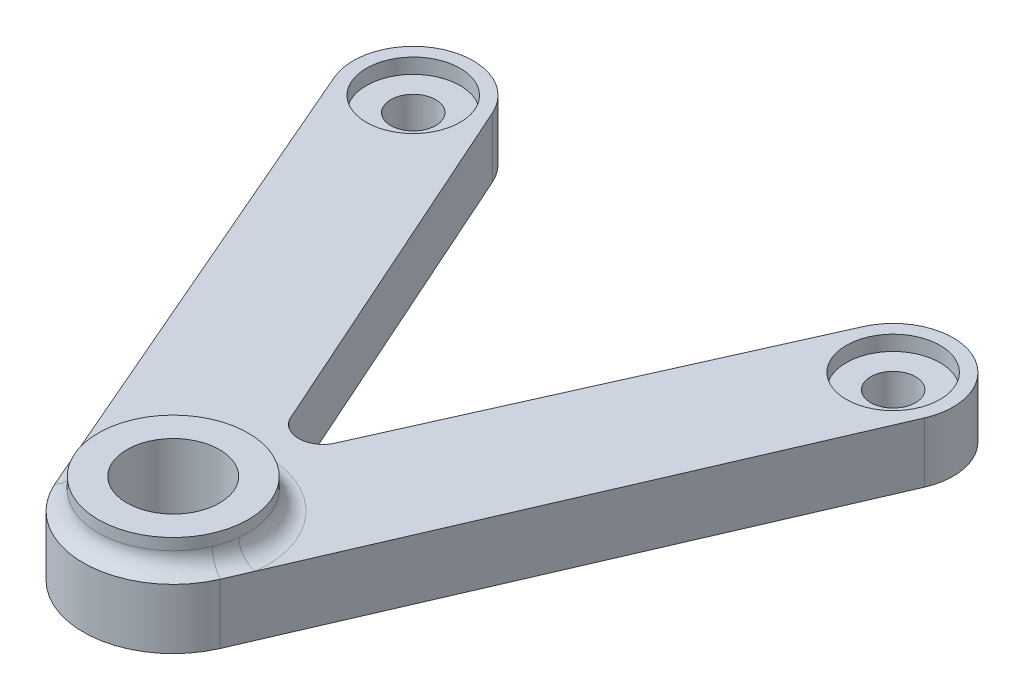
ISO-10303-21;
HEADER;
FILE_DESCRIPTION(('STEP AP214'),'2;1');
FILE_NAME('part.step','',(''),(''),'','','');
FILE_SCHEMA(('AUTOMOTIVE_DESIGN { 1 0 10303 214 1 1 1 1 }'));
ENDSEC;
DATA;
#1=APPLICATION_CONTEXT('core data for automotive mechanical design processes');
#2=APPLICATION_PROTOCOL_DEFINITION('international standard','automotive_design',2000,#1);
#3=PRODUCT_CONTEXT('',#1,'mechanical');
#4=PRODUCT('Part','Part','',(#3));
#5=PRODUCT_RELATED_PRODUCT_CATEGORY('part','',(#4));
#6=PRODUCT_DEFINITION_FORMATION('','',#4);
#7=PRODUCT_DEFINITION_CONTEXT('part definition',#1,'design');
#8=PRODUCT_DEFINITION('design','',#6,#7);
#9=PRODUCT_DEFINITION_SHAPE('','',#8);
#10=(LENGTH_UNIT() NAMED_UNIT(*) SI_UNIT(.MILLI.,.METRE.));
#11=(NAMED_UNIT(*) PLANE_ANGLE_UNIT() SI_UNIT($,.RADIAN.));
#12=(NAMED_UNIT(*) SI_UNIT($,.STERADIAN.) SOLID_ANGLE_UNIT());
#13=UNCERTAINTY_MEASURE_WITH_UNIT(LENGTH_MEASURE(1.E-05),#10,'distance_accuracy_value','');
#14=(GEOMETRIC_REPRESENTATION_CONTEXT(3) GLOBAL_UNCERTAINTY_ASSIGNED_CONTEXT((#13)) GLOBAL_UNIT_ASSIGNED_CONTEXT((#10,
#11,#12)) REPRESENTATION_CONTEXT('',''));
#15=CARTESIAN_POINT('',(0.,0.,0.));
#16=DIRECTION('',(0.,0.,1.));
#17=DIRECTION('',(1.,0.,0.));
#18=AXIS2_PLACEMENT_3D('',#15,#16,#17);
#19=CARTESIAN_POINT('',(0.,6.35,-19.1326419315339));
#20=DIRECTION('',(0.,-1.,0.));
#21=DIRECTION('',(0.,0.,-1.));
#22=AXIS2_PLACEMENT_3D('',#19,#20,#21);
#23=CYLINDRICAL_SURFACE('',#22,2.60351351052223);
#24=CARTESIAN_POINT('',(0.,0.,-19.1326419315339));
#25=DIRECTION('',(0.,1.,0.));
#26=DIRECTION('',(0.,0.,1.));
#27=AXIS2_PLACEMENT_3D('',#24,#25,#26);
#28=CIRCLE('',#27,2.60351351052223);
#29=CARTESIAN_POINT('',(-2.26024053048188,0.,-17.8405137088568));
#30=VERTEX_POINT('',#29);
#31=CARTESIAN_POINT('',(2.26024053048188,0.,-17.8405137088568));
#32=VERTEX_POINT('',#31);
#33=EDGE_CURVE('E129',#30,#32,#28,.T.);
#34=ORIENTED_EDGE('',*,*,#33,.F.);
#35=DIRECTION('',(0.,-1.,0.));
#36=VECTOR('',#35,1.);
#37=CARTESIAN_POINT('',(-2.26024053048188,6.35,-17.8405137088568));
#38=LINE('',#37,#36);
#39=CARTESIAN_POINT('',(-2.26024053048188,6.35,-17.8405137088568));
#40=VERTEX_POINT('',#39);
#41=EDGE_CURVE('E123',#40,#30,#38,.T.);
#42=ORIENTED_EDGE('',*,*,#41,.F.);
#43=CARTESIAN_POINT('',(0.,6.35,-19.1326419315339));
#44=DIRECTION('',(0.,1.,0.));
#45=DIRECTION('',(0.,0.,1.));
#46=AXIS2_PLACEMENT_3D('',#43,#44,#45);
#47=CIRCLE('',#46,2.60351351052223);
#48=CARTESIAN_POINT('',(2.26024053048188,6.35,-17.8405137088568));
#49=VERTEX_POINT('',#48);
#50=EDGE_CURVE('E126',#40,#49,#47,.T.);
#51=ORIENTED_EDGE('',*,*,#50,.T.);
#52=DIRECTION('',(0.,-1.,0.));
#53=VECTOR('',#52,1.);
#54=CARTESIAN_POINT('',(2.26024053048188,6.35,-17.8405137088568));
#55=LINE('',#54,#53);
#56=EDGE_CURVE('E171',#49,#32,#55,.T.);
#57=ORIENTED_EDGE('',*,*,#56,.T.);
#58=EDGE_LOOP('',(#34,#42,#51,#57));
#59=FACE_BOUND('',#58,.T.);
#60=ADVANCED_FACE('F37',(#59),#23,.F.);
#61=CARTESIAN_POINT('',(4.7614095283321,6.35,-2.12775872381943));
#62=DIRECTION('',(-0.912985825560001,0.,0.407991277267693));
#63=DIRECTION('',(0.407991277267693,0.,0.912985825560001));
#64=AXIS2_PLACEMENT_3D('',#61,#62,#63);
#65=PLANE('',#64);
#66=DIRECTION('',(-0.407991277267693,0.,-0.912985825560001));
#67=VECTOR('',#66,1.);
#68=CARTESIAN_POINT('',(4.7614095283321,0.,-2.12775872381943));
#69=LINE('',#68,#67);
#70=CARTESIAN_POINT('',(-19.602540007694,0.,-56.6483865421838));
#71=VERTEX_POINT('',#70);
#72=EDGE_CURVE('E173',#30,#71,#69,.T.);
#73=ORIENTED_EDGE('',*,*,#72,.T.);
#74=DIRECTION('',(0.,-1.,0.));
#75=VECTOR('',#74,1.);
#76=CARTESIAN_POINT('',(-19.602540007694,6.35,-56.6483865421838));
#77=LINE('',#76,#75);
#78=CARTESIAN_POINT('',(-19.602540007694,6.35,-56.6483865421838));
#79=VERTEX_POINT('',#78);
#80=EDGE_CURVE('E134',#79,#71,#77,.T.);
#81=ORIENTED_EDGE('',*,*,#80,.F.);
#82=DIRECTION('',(-0.407991277267693,0.,-0.912985825560001));
#83=VECTOR('',#82,1.);
#84=CARTESIAN_POINT('',(4.7614095283321,6.35,-2.12775872381943));
#85=LINE('',#84,#83);
#86=EDGE_CURVE('E138',#40,#79,#85,.T.);
#87=ORIENTED_EDGE('',*,*,#86,.F.);
#88=ORIENTED_EDGE('',*,*,#41,.T.);
#89=EDGE_LOOP('',(#73,#81,#87,#88));
#90=FACE_BOUND('',#89,.T.);
#91=ADVANCED_FACE('F139',(#90),#65,.F.);
#92=CARTESIAN_POINT('',(-25.4,6.35,-54.0576419315339));
#93=DIRECTION('',(0.,-1.,0.));
#94=DIRECTION('',(0.,0.,-1.));
#95=AXIS2_PLACEMENT_3D('',#92,#93,#94);
#96=CYLINDRICAL_SURFACE('',#95,6.35);
#97=CARTESIAN_POINT('',(-25.4,0.,-54.0576419315339));
#98=DIRECTION('',(0.,1.,0.));
#99=DIRECTION('',(0.,0.,1.));
#100=AXIS2_PLACEMENT_3D('',#97,#98,#99);
#101=CIRCLE('',#100,6.35);
#102=CARTESIAN_POINT('',(-31.2294813240886,0.,-51.5397762694896));
#103=VERTEX_POINT('',#102);
#104=EDGE_CURVE('E175',#71,#103,#101,.T.);
#105=ORIENTED_EDGE('',*,*,#104,.T.);
#106=DIRECTION('',(0.,-1.,0.));
#107=VECTOR('',#106,1.);
#108=CARTESIAN_POINT('',(-31.2294813240886,6.35,-51.5397762694896));
#109=LINE('',#108,#107);
#110=CARTESIAN_POINT('',(-31.2294813240886,6.35,-51.5397762694896));
#111=VERTEX_POINT('',#110);
#112=EDGE_CURVE('E199',#111,#103,#109,.T.);
#113=ORIENTED_EDGE('',*,*,#112,.F.);
#114=CARTESIAN_POINT('',(-25.4,6.35,-54.0576419315339));
#115=DIRECTION('',(0.,1.,0.));
#116=DIRECTION('',(0.,0.,1.));
#117=AXIS2_PLACEMENT_3D('',#114,#115,#116);
#118=CIRCLE('',#117,6.35);
#119=EDGE_CURVE('E142',#79,#111,#118,.T.);
#120=ORIENTED_EDGE('',*,*,#119,.F.);
#121=ORIENTED_EDGE('',*,*,#80,.T.);
#122=EDGE_LOOP('',(#105,#113,#120,#121));
#123=FACE_BOUND('',#122,.T.);
#124=ADVANCED_FACE('F295',(#123),#96,.T.);
#125=CARTESIAN_POINT('',(-7.55840309085105,6.35,3.26462039147518));
#126=DIRECTION('',(0.918028554974588,0.,-0.396514277487294));
#127=DIRECTION('',(-0.396514277487294,0.,-0.918028554974588));
#128=AXIS2_PLACEMENT_3D('',#125,#126,#127);
#129=PLANE('',#128);
#130=DIRECTION('',(0.396514277487294,0.,0.918028554974588));
#131=VECTOR('',#130,1.);
#132=CARTESIAN_POINT('',(-7.55840309085105,0.,3.26462039147518));
#133=LINE('',#132,#131);
#134=CARTESIAN_POINT('',(-8.74422198613295,0.,0.519156561532535));
#135=VERTEX_POINT('',#134);
#136=EDGE_CURVE('E178',#103,#135,#133,.T.);
#137=ORIENTED_EDGE('',*,*,#136,.T.);
#138=DIRECTION('',(0.,-1.,0.));
#139=VECTOR('',#138,1.);
#140=CARTESIAN_POINT('',(-8.74422198613295,6.35,0.519156561532535));
#141=LINE('',#140,#139);
#142=CARTESIAN_POINT('',(-8.74422198613295,6.35,0.519156561532535));
#143=VERTEX_POINT('',#142);
#144=EDGE_CURVE('E196',#143,#135,#141,.T.);
#145=ORIENTED_EDGE('',*,*,#144,.F.);
#146=DIRECTION('',(0.396514277487294,0.,0.918028554974588));
#147=VECTOR('',#146,1.);
#148=CARTESIAN_POINT('',(-7.55840309085105,6.35,3.26462039147518));
#149=LINE('',#148,#147);
#150=CARTESIAN_POINT('',(-9.867714334644,6.35,-2.08200590798701));
#151=VERTEX_POINT('',#150);
#152=EDGE_CURVE('E158',#151,#143,#149,.T.);
#153=ORIENTED_EDGE('',*,*,#152,.F.);
#154=EDGE_CURVE('E159',#111,#151,#149,.T.);
#155=ORIENTED_EDGE('',*,*,#154,.F.);
#156=ORIENTED_EDGE('',*,*,#112,.T.);
#157=EDGE_LOOP('',(#137,#145,#153,#155,#156));
#158=FACE_BOUND('',#157,.T.);
#159=ADVANCED_FACE('F299',(#158),#129,.F.);
#160=CARTESIAN_POINT('',(0.,6.35,-3.25764193153394));
#161=DIRECTION('',(0.,-1.,0.));
#162=DIRECTION('',(0.,0.,-1.));
#163=AXIS2_PLACEMENT_3D('',#160,#161,#162);
#164=CYLINDRICAL_SURFACE('',#163,9.52500000000001);
#165=CARTESIAN_POINT('',(0.,0.,-3.25764193153394));
#166=DIRECTION('',(0.,1.,0.));
#167=DIRECTION('',(0.,0.,1.));
#168=AXIS2_PLACEMENT_3D('',#165,#166,#167);
#169=CIRCLE('',#168,9.52500000000001);
#170=CARTESIAN_POINT('',(8.74422198613295,0.,0.519156561532535));
#171=VERTEX_POINT('',#170);
#172=EDGE_CURVE('E181',#135,#171,#169,.T.);
#173=ORIENTED_EDGE('',*,*,#172,.T.);
#174=DIRECTION('',(0.,-1.,0.));
#175=VECTOR('',#174,1.);
#176=CARTESIAN_POINT('',(8.74422198613295,6.35,0.519156561532535));
#177=LINE('',#176,#175);
#178=CARTESIAN_POINT('',(8.74422198613295,6.35,0.519156561532535));
#179=VERTEX_POINT('',#178);
#180=EDGE_CURVE('E194',#179,#171,#177,.T.);
#181=ORIENTED_EDGE('',*,*,#180,.F.);
#182=CARTESIAN_POINT('',(0.,6.35,-3.25764193153394));
#183=DIRECTION('',(0.,1.,0.));
#184=DIRECTION('',(0.,0.,1.));
#185=AXIS2_PLACEMENT_3D('',#182,#183,#184);
#186=CIRCLE('',#185,9.52500000000001);
#187=EDGE_CURVE('E161',#143,#179,#186,.T.);
#188=ORIENTED_EDGE('',*,*,#187,.F.);
#189=ORIENTED_EDGE('',*,*,#144,.T.);
#190=EDGE_LOOP('',(#173,#181,#188,#189));
#191=FACE_BOUND('',#190,.T.);
#192=ADVANCED_FACE('F306',(#191),#164,.T.);
#193=CARTESIAN_POINT('',(7.55840309085105,6.35,3.26462039147518));
#194=DIRECTION('',(0.918028554974588,0.,0.396514277487294));
#195=DIRECTION('',(0.396514277487294,0.,-0.918028554974588));
#196=AXIS2_PLACEMENT_3D('',#193,#194,#195);
#197=PLANE('',#196);
#198=DIRECTION('',(-0.396514277487294,0.,0.918028554974588));
#199=VECTOR('',#198,1.);
#200=CARTESIAN_POINT('',(7.55840309085105,0.,3.26462039147518));
#201=LINE('',#200,#199);
#202=CARTESIAN_POINT('',(31.2294813240886,0.,-51.5397762694896));
#203=VERTEX_POINT('',#202);
#204=EDGE_CURVE('E184',#203,#171,#201,.T.);
#205=ORIENTED_EDGE('',*,*,#204,.F.);
#206=DIRECTION('',(0.,-1.,0.));
#207=VECTOR('',#206,1.);
#208=CARTESIAN_POINT('',(31.2294813240886,6.35,-51.5397762694896));
#209=LINE('',#208,#207);
#210=CARTESIAN_POINT('',(31.2294813240886,6.35,-51.5397762694896));
#211=VERTEX_POINT('',#210);
#212=EDGE_CURVE('E192',#211,#203,#209,.T.);
#213=ORIENTED_EDGE('',*,*,#212,.F.);
#214=DIRECTION('',(-0.396514277487294,0.,0.918028554974588));
#215=VECTOR('',#214,1.);
#216=CARTESIAN_POINT('',(7.55840309085105,6.35,3.26462039147518));
#217=LINE('',#216,#215);
#218=CARTESIAN_POINT('',(9.867714334644,6.35,-2.08200590798701));
#219=VERTEX_POINT('',#218);
#220=EDGE_CURVE('E165',#211,#219,#217,.T.);
#221=ORIENTED_EDGE('',*,*,#220,.T.);
#222=EDGE_CURVE('E164',#219,#179,#217,.T.);
#223=ORIENTED_EDGE('',*,*,#222,.T.);
#224=ORIENTED_EDGE('',*,*,#180,.T.);
#225=EDGE_LOOP('',(#205,#213,#221,#223,#224));
#226=FACE_BOUND('',#225,.T.);
#227=ADVANCED_FACE('F350',(#226),#197,.T.);
#228=CARTESIAN_POINT('',(25.4,6.35,-54.0576419315339));
#229=DIRECTION('',(0.,-1.,0.));
#230=DIRECTION('',(0.,0.,-1.));
#231=AXIS2_PLACEMENT_3D('',#228,#229,#230);
#232=CYLINDRICAL_SURFACE('',#231,6.35);
#233=CARTESIAN_POINT('',(25.4,0.,-54.0576419315339));
#234=DIRECTION('',(0.,1.,0.));
#235=DIRECTION('',(0.,0.,1.));
#236=AXIS2_PLACEMENT_3D('',#233,#234,#235);
#237=CIRCLE('',#236,6.35);
#238=CARTESIAN_POINT('',(19.602540007694,0.,-56.6483865421838));
#239=VERTEX_POINT('',#238);
#240=EDGE_CURVE('E151',#239,#203,#237,.F.);
#241=ORIENTED_EDGE('',*,*,#240,.F.);
#242=DIRECTION('',(0.,-1.,0.));
#243=VECTOR('',#242,1.);
#244=CARTESIAN_POINT('',(19.602540007694,6.35,-56.6483865421838));
#245=LINE('',#244,#243);
#246=CARTESIAN_POINT('',(19.602540007694,6.35,-56.6483865421838));
#247=VERTEX_POINT('',#246);
#248=EDGE_CURVE('E190',#247,#239,#245,.T.);
#249=ORIENTED_EDGE('',*,*,#248,.F.);
#250=CARTESIAN_POINT('',(25.4,6.35,-54.0576419315339));
#251=DIRECTION('',(0.,1.,0.));
#252=DIRECTION('',(0.,0.,1.));
#253=AXIS2_PLACEMENT_3D('',#250,#251,#252);
#254=CIRCLE('',#253,6.35);
#255=EDGE_CURVE('E167',#247,#211,#254,.F.);
#256=ORIENTED_EDGE('',*,*,#255,.T.);
#257=ORIENTED_EDGE('',*,*,#212,.T.);
#258=EDGE_LOOP('',(#241,#249,#256,#257));
#259=FACE_BOUND('',#258,.T.);
#260=ADVANCED_FACE('F355',(#259),#232,.T.);
#261=CARTESIAN_POINT('',(-4.7614095283321,6.35,-2.12775872381943));
#262=DIRECTION('',(-0.912985825560001,0.,-0.407991277267693));
#263=DIRECTION('',(-0.407991277267693,0.,0.912985825560001));
#264=AXIS2_PLACEMENT_3D('',#261,#262,#263);
#265=PLANE('',#264);
#266=DIRECTION('',(0.407991277267693,0.,-0.912985825560001));
#267=VECTOR('',#266,1.);
#268=CARTESIAN_POINT('',(-4.7614095283321,0.,-2.12775872381943));
#269=LINE('',#268,#267);
#270=EDGE_CURVE('E148',#32,#239,#269,.T.);
#271=ORIENTED_EDGE('',*,*,#270,.F.);
#272=ORIENTED_EDGE('',*,*,#56,.F.);
#273=DIRECTION('',(0.407991277267693,0.,-0.912985825560001));
#274=VECTOR('',#273,1.);
#275=CARTESIAN_POINT('',(-4.7614095283321,6.35,-2.12775872381943));
#276=LINE('',#275,#274);
#277=EDGE_CURVE('E147',#49,#247,#276,.T.);
#278=ORIENTED_EDGE('',*,*,#277,.T.);
#279=ORIENTED_EDGE('',*,*,#248,.T.);
#280=EDGE_LOOP('',(#271,#272,#278,#279));
#281=FACE_BOUND('',#280,.T.);
#282=ADVANCED_FACE('F358',(#281),#265,.T.);
#283=CARTESIAN_POINT('',(0.,6.35,0.));
#284=DIRECTION('',(0.,1.,0.));
#285=DIRECTION('',(0.,0.,1.));
#286=AXIS2_PLACEMENT_3D('',#283,#284,#285);
#287=PLANE('',#286);
#288=CARTESIAN_POINT('',(-25.4,6.35,-54.0576419315339));
#289=DIRECTION('',(0.,1.,0.));
#290=DIRECTION('',(0.,0.,1.));
#291=AXIS2_PLACEMENT_3D('',#288,#289,#290);
#292=CIRCLE('',#291,4.96100099999999);
#293=CARTESIAN_POINT('',(-25.4,6.35,-49.0966409315339));
#294=VERTEX_POINT('',#293);
#295=EDGE_CURVE('E399',#294,#294,#292,.T.);
#296=ORIENTED_EDGE('',*,*,#295,.F.);
#297=EDGE_LOOP('',(#296));
#298=FACE_BOUND('',#297,.T.);
#299=CARTESIAN_POINT('',(25.4,6.35,-54.0576419315339));
#300=DIRECTION('',(0.,1.,0.));
#301=DIRECTION('',(0.,0.,1.));
#302=AXIS2_PLACEMENT_3D('',#299,#300,#301);
#303=CIRCLE('',#302,4.96100099999999);
#304=CARTESIAN_POINT('',(25.4,6.35,-49.096640931534));
#305=VERTEX_POINT('',#304);
#306=EDGE_CURVE('E253',#305,#305,#303,.T.);
#307=ORIENTED_EDGE('',*,*,#306,.F.);
#308=EDGE_LOOP('',(#307));
#309=FACE_BOUND('',#308,.T.);
#310=ORIENTED_EDGE('',*,*,#154,.T.);
#311=CARTESIAN_POINT('',(0.,6.35,-3.25764193153394));
#312=DIRECTION('',(0.,1.,0.));
#313=DIRECTION('',(0.,0.,1.));
#314=AXIS2_PLACEMENT_3D('',#311,#312,#313);
#315=CIRCLE('',#314,9.9375);
#316=EDGE_CURVE('E11',#151,#219,#315,.F.);
#317=ORIENTED_EDGE('',*,*,#316,.T.);
#318=ORIENTED_EDGE('',*,*,#220,.F.);
#319=ORIENTED_EDGE('',*,*,#255,.F.);
#320=ORIENTED_EDGE('',*,*,#277,.F.);
#321=ORIENTED_EDGE('',*,*,#50,.F.);
#322=ORIENTED_EDGE('',*,*,#86,.T.);
#323=ORIENTED_EDGE('',*,*,#119,.T.);
#324=EDGE_LOOP('',(#310,#317,#318,#319,#320,#321,#322,#323));
#325=FACE_BOUND('',#324,.T.);
#326=ADVANCED_FACE('F144',(#298,#309,#325),#287,.T.);
#327=CARTESIAN_POINT('',(0.,0.,0.));
#328=DIRECTION('',(0.,1.,0.));
#329=DIRECTION('',(0.,0.,1.));
#330=AXIS2_PLACEMENT_3D('',#327,#328,#329);
#331=PLANE('',#330);
#332=CARTESIAN_POINT('',(0.,0.,-3.25764193153394));
#333=DIRECTION('',(0.,1.,0.));
#334=DIRECTION('',(0.,0.,1.));
#335=AXIS2_PLACEMENT_3D('',#332,#333,#334);
#336=CIRCLE('',#335,4.90219999999999);
#337=CARTESIAN_POINT('',(0.,0.,1.64455806846605));
#338=VERTEX_POINT('',#337);
#339=EDGE_CURVE('E264',#338,#338,#336,.T.);
#340=ORIENTED_EDGE('',*,*,#339,.T.);
#341=EDGE_LOOP('',(#340));
#342=FACE_BOUND('',#341,.T.);
#343=CARTESIAN_POINT('',(-25.4,0.,-54.0576419315339));
#344=DIRECTION('',(0.,1.,0.));
#345=DIRECTION('',(0.,0.,1.));
#346=AXIS2_PLACEMENT_3D('',#343,#344,#345);
#347=CIRCLE('',#346,2.38125);
#348=CARTESIAN_POINT('',(-25.4,0.,-51.6763919315339));
#349=VERTEX_POINT('',#348);
#350=EDGE_CURVE('E270',#349,#349,#347,.T.);
#351=ORIENTED_EDGE('',*,*,#350,.T.);
#352=EDGE_LOOP('',(#351));
#353=FACE_BOUND('',#352,.T.);
#354=CARTESIAN_POINT('',(25.4,0.,-54.0576419315339));
#355=DIRECTION('',(0.,1.,0.));
#356=DIRECTION('',(0.,0.,1.));
#357=AXIS2_PLACEMENT_3D('',#354,#355,#356);
#358=CIRCLE('',#357,2.38125);
#359=CARTESIAN_POINT('',(25.4,0.,-51.6763919315339));
#360=VERTEX_POINT('',#359);
#361=EDGE_CURVE('E154',#360,#360,#358,.T.);
#362=ORIENTED_EDGE('',*,*,#361,.T.);
#363=EDGE_LOOP('',(#362));
#364=FACE_BOUND('',#363,.T.);
#365=ORIENTED_EDGE('',*,*,#33,.T.);
#366=ORIENTED_EDGE('',*,*,#270,.T.);
#367=ORIENTED_EDGE('',*,*,#240,.T.);
#368=ORIENTED_EDGE('',*,*,#204,.T.);
#369=ORIENTED_EDGE('',*,*,#172,.F.);
#370=ORIENTED_EDGE('',*,*,#136,.F.);
#371=ORIENTED_EDGE('',*,*,#104,.F.);
#372=ORIENTED_EDGE('',*,*,#72,.F.);
#373=EDGE_LOOP('',(#365,#366,#367,#368,#369,#370,#371,#372));
#374=FACE_BOUND('',#373,.T.);
#375=ADVANCED_FACE('F277',(#342,#353,#364,#374),#331,.F.);
#376=CARTESIAN_POINT('',(25.4,6.35,-54.0576419315339));
#377=DIRECTION('',(0.,1.,0.));
#378=DIRECTION('',(0.,0.,1.));
#379=AXIS2_PLACEMENT_3D('',#376,#377,#378);
#380=CYLINDRICAL_SURFACE('',#379,2.38125);
#381=CARTESIAN_POINT('',(25.4,4.7625,-54.0576419315339));
#382=DIRECTION('',(0.,-1.,0.));
#383=DIRECTION('',(0.,0.,-1.));
#384=AXIS2_PLACEMENT_3D('',#381,#382,#383);
#385=CIRCLE('',#384,2.38125);
#386=CARTESIAN_POINT('',(25.4,4.7625,-56.4388919315339));
#387=VERTEX_POINT('',#386);
#388=EDGE_CURVE('E244',#387,#387,#385,.F.);
#389=ORIENTED_EDGE('',*,*,#388,.T.);
#390=EDGE_LOOP('',(#389));
#391=FACE_BOUND('',#390,.T.);
#392=ORIENTED_EDGE('',*,*,#361,.F.);
#393=EDGE_LOOP('',(#392));
#394=FACE_BOUND('',#393,.T.);
#395=ADVANCED_FACE('F280',(#391,#394),#380,.F.);
#396=CARTESIAN_POINT('',(-25.4,6.35,-54.0576419315339));
#397=DIRECTION('',(0.,1.,0.));
#398=DIRECTION('',(0.,0.,1.));
#399=AXIS2_PLACEMENT_3D('',#396,#397,#398);
#400=CYLINDRICAL_SURFACE('',#399,2.38125);
#401=CARTESIAN_POINT('',(-25.4,4.7625,-54.0576419315339));
#402=DIRECTION('',(0.,-1.,0.));
#403=DIRECTION('',(0.,0.,-1.));
#404=AXIS2_PLACEMENT_3D('',#401,#402,#403);
#405=CIRCLE('',#404,2.38125);
#406=CARTESIAN_POINT('',(-25.4,4.7625,-56.4388919315339));
#407=VERTEX_POINT('',#406);
#408=EDGE_CURVE('E41',#407,#407,#405,.F.);
#409=ORIENTED_EDGE('',*,*,#408,.T.);
#410=EDGE_LOOP('',(#409));
#411=FACE_BOUND('',#410,.T.);
#412=ORIENTED_EDGE('',*,*,#350,.F.);
#413=EDGE_LOOP('',(#412));
#414=FACE_BOUND('',#413,.T.);
#415=ADVANCED_FACE('F282',(#411,#414),#400,.F.);
#416=CARTESIAN_POINT('',(0.,9.525,-3.25764193153394));
#417=DIRECTION('',(0.,-1.,0.));
#418=DIRECTION('',(0.,0.,-1.));
#419=AXIS2_PLACEMENT_3D('',#416,#417,#418);
#420=CYLINDRICAL_SURFACE('',#419,7.9375);
#421=CARTESIAN_POINT('',(0.,8.35,-3.25764193153394));
#422=DIRECTION('',(0.,1.,0.));
#423=DIRECTION('',(0.,0.,1.));
#424=AXIS2_PLACEMENT_3D('',#421,#422,#423);
#425=CIRCLE('',#424,7.9375);
#426=CARTESIAN_POINT('',(7.88175924842634,8.35,-2.3186119001474));
#427=VERTEX_POINT('',#426);
#428=CARTESIAN_POINT('',(-7.88175924842634,8.35,-2.3186119001474));
#429=VERTEX_POINT('',#428);
#430=EDGE_CURVE('E133',#427,#429,#425,.T.);
#431=ORIENTED_EDGE('',*,*,#430,.T.);
#432=CARTESIAN_POINT('',(-7.92321061865644,8.34168497496145,-2.78157497992963));
#433=CARTESIAN_POINT('',(-7.91913868807956,6.163454674835,-2.71380559691229));
#434=CARTESIAN_POINT('',(-10.0868601345559,6.35,-2.5893825989268));
#435=CARTESIAN_POINT('',(-7.91669546929499,8.34589950342088,-2.67310379136009));
#436=CARTESIAN_POINT('',(-7.9131042779648,6.21341907660837,-2.62774990594332));
#437=CARTESIAN_POINT('',(-10.0361440329662,6.35,-2.47196228873919));
#438=CARTESIAN_POINT('',(-7.90794662079986,8.34829486296564,-2.56474024336233));
#439=CARTESIAN_POINT('',(-7.90529815447626,6.25889680312374,-2.53632754715262));
#440=CARTESIAN_POINT('',(-9.98503730748947,6.35,-2.35363758770654));
#441=CARTESIAN_POINT('',(-7.88600715792508,8.35040380857174,-2.34846714208903));
#442=CARTESIAN_POINT('',(-7.88566627573058,6.34063042595973,-2.34736387152889));
#443=CARTESIAN_POINT('',(-9.88215644335452,6.35,-2.11544295916792));
#444=CARTESIAN_POINT('',(-7.87281746369545,8.35011794985631,-2.2405574994495));
#445=CARTESIAN_POINT('',(-7.87389448177011,6.37717510325908,-2.24969767242746));
#446=CARTESIAN_POINT('',(-9.83038244509173,6.35,-1.99557335671212));
#447=CARTESIAN_POINT('',(-7.84202122626159,8.34782212550529,-2.0253998092539));
#448=CARTESIAN_POINT('',(-7.84580996391774,6.44235145610592,-2.05028102463539));
#449=CARTESIAN_POINT('',(-9.72626654989119,6.35,-1.75451932600602));
#450=CARTESIAN_POINT('',(-7.82441525759023,8.34581238405506,-1.91815167749699));
#451=CARTESIAN_POINT('',(-7.82953720351223,6.4711981551057,-1.94834464616127));
#452=CARTESIAN_POINT('',(-9.67392472767099,6.35,-1.63333507074527));
#453=CARTESIAN_POINT('',(-7.78481952756381,8.34085312705979,-1.70448384499291));
#454=CARTESIAN_POINT('',(-7.79221831870739,6.52217682757576,-1.74189023648997));
#455=CARTESIAN_POINT('',(-9.56875572359912,6.35,-1.3898428327153));
#456=CARTESIAN_POINT('',(-7.76282954840791,8.3379035648194,-1.59806418567789));
#457=CARTESIAN_POINT('',(-7.77119072331872,6.54446445080352,-1.63714895520172));
#458=CARTESIAN_POINT('',(-9.51592851775767,6.35,-1.26753479440381));
#459=CARTESIAN_POINT('',(-7.69160307763475,8.32886364594183,-1.28586860197355));
#460=CARTESIAN_POINT('',(-7.70229177367304,6.60141651347303,-1.32805420148421));
#461=CARTESIAN_POINT('',(-9.35963121630324,6.35,-0.905667911047432));
#462=CARTESIAN_POINT('',(-7.63628636185011,8.32244439072282,-1.08145042152646));
#463=CARTESIAN_POINT('',(-7.64711658146589,6.62899253376005,-1.11877734738483));
#464=CARTESIAN_POINT('',(-9.25558306147864,6.35,-0.664770716054334));
#465=CARTESIAN_POINT('',(-7.50949636172234,8.31244926514031,-0.677691024727496));
#466=CARTESIAN_POINT('',(-7.51830077946592,6.66741930252371,-0.702923726873053));
#467=CARTESIAN_POINT('',(-9.04662023880275,6.35,-0.180970134243739));
#468=CARTESIAN_POINT('',(-7.43802530349917,8.30887300330967,-0.478349113056965));
#469=CARTESIAN_POINT('',(-7.44429242472927,6.67864614601979,-0.4944131857377));
#470=CARTESIAN_POINT('',(-8.94170569226044,6.35,0.0619329717134883));
#471=CARTESIAN_POINT('',(-7.27759134540718,8.30624467153017,-0.0815779918430826));
#472=CARTESIAN_POINT('',(-7.27746303764007,6.68702707366524,-0.0806848052865282));
#473=CARTESIAN_POINT('',(-8.72930520060399,6.35,0.553692606869403));
#474=CARTESIAN_POINT('',(-7.18827125898213,8.30729614151715,0.115707415695912));
#475=CARTESIAN_POINT('',(-7.18350048928545,6.6839388206529,0.126367233187051));
#476=CARTESIAN_POINT('',(-8.62181448226827,6.35,0.802560187255787));
#477=CARTESIAN_POINT('',(-6.99380147766085,8.31367002836996,0.502341595259835));
#478=CARTESIAN_POINT('',(-6.98057424756784,6.66257354182981,0.527456274366948));
#479=CARTESIAN_POINT('',(-8.40733413152436,6.35,1.29913521025779));
#480=CARTESIAN_POINT('',(-6.88864837551744,8.31899336560701,0.691688647719607));
#481=CARTESIAN_POINT('',(-6.87052082186305,6.64408479237901,0.72334309865922));
#482=CARTESIAN_POINT('',(-8.30034461209605,6.35,1.54684239129706));
#483=CARTESIAN_POINT('',(-6.71808545993844,8.32810992233046,0.971258570971318));
#484=CARTESIAN_POINT('',(-6.69664084303055,6.60224305209462,1.0053975875876));
#485=CARTESIAN_POINT('',(-8.13936254789053,6.35,1.91955565830962));
#486=CARTESIAN_POINT('',(-6.65821047534579,8.33138865075115,1.06491466030385));
#487=CARTESIAN_POINT('',(-6.63573322142623,6.58542617568186,1.09950393271659));
#488=CARTESIAN_POINT('',(-8.08489484948495,6.35,2.04566184237174));
#489=CARTESIAN_POINT('',(-6.5345755249812,8.33769375367214,1.24963853909491));
#490=CARTESIAN_POINT('',(-6.51179069828715,6.54605623383036,1.28266453158733));
#491=CARTESIAN_POINT('',(-7.97637430510394,6.35,2.2969137245851));
#492=CARTESIAN_POINT('',(-6.47081562855001,8.34072013267427,1.34070637470798));
#493=CARTESIAN_POINT('',(-6.44856801290175,6.5233856138002,1.37190250775745));
#494=CARTESIAN_POINT('',(-7.92232145174343,6.35,2.42205943983464));
#495=CARTESIAN_POINT('',(-6.33952710403949,8.34581103222199,1.5200827181101));
#496=CARTESIAN_POINT('',(-6.32100654854449,6.47135197629328,1.54457589347108));
#497=CARTESIAN_POINT('',(-7.81473142260151,6.35,2.67115694928308));
#498=CARTESIAN_POINT('',(-6.27199901133334,8.34787568901831,1.60839161511334));
#499=CARTESIAN_POINT('',(-6.25647985730434,6.44182334118269,1.62816135252568));
#500=CARTESIAN_POINT('',(-7.76119417482549,6.35,2.7951089101673));
#501=CARTESIAN_POINT('',(-6.13328130206403,8.35015864871548,1.7821129986339));
#502=CARTESIAN_POINT('',(-6.12771818956425,6.37496267548846,1.78873933219677));
#503=CARTESIAN_POINT('',(-7.65471893231998,6.35,3.04162541302142));
#504=CARTESIAN_POINT('',(-6.06209132860346,8.35037677130347,1.86752520147983));
#505=CARTESIAN_POINT('',(-6.06331064635676,6.33740051713674,1.86583702347335));
#506=CARTESIAN_POINT('',(-7.60178099661699,6.35,3.16418981833042));
#507=CARTESIAN_POINT('',(-5.9891347469578,8.34922873114747,1.95140512457745));
#508=CARTESIAN_POINT('',(-6.00048889428218,6.29566015540645,1.93835062199185));
#509=CARTESIAN_POINT('',(-7.54919363073877,6.35,3.28594256784812));
#510=(BOUNDED_SURFACE() B_SPLINE_SURFACE(3,2,((#432,#433,#434),(#435,#436,#437),(#438,#439,
#440),(#441,#442,#443),(#444,#445,#446),(#447,#448,#449),(#450,#451,#452),(#453,#454,#455),
(#456,#457,#458),(#459,#460,#461),(#462,#463,#464),(#465,#466,#467),(#468,#469,#470),(#471,#472,
#473),(#474,#475,#476),(#477,#478,#479),(#480,#481,#482),(#483,#484,#485),(#486,#487,#488),
(#489,#490,#491),(#492,#493,#494),(#495,#496,#497),(#498,#499,#500),(#501,#502,#503),(#504,#505,
#506),(#507,#508,#509)),.UNSPECIFIED.,.F.,.F.,.F.) B_SPLINE_SURFACE_WITH_KNOTS((4,2,2,2,2,2,2,2,
2,2,2,2,4),(3,3),(0.,0.408263380677385,0.8164422205645,1.22456798616005,1.63271403279515,
2.42741439126504,3.22200530418352,4.03446351166703,4.8470968097908,5.26461703766217,
5.68212981550668,6.09958342476916,6.51707779763496),(0.,1.),
.UNSPECIFIED.) GEOMETRIC_REPRESENTATION_ITEM() RATIONAL_B_SPLINE_SURFACE(((1.,0.676150585185413,
1.),(1.,0.684050480555318,1.),(1.,0.691486421178658,1.),(1.,0.705427060470186,1.),(1.,
0.711931951655654,1.),(1.,0.724009647597399,1.),(1.,0.729582573440149,1.),(1.,0.739796999220544,
1.),(1.,0.744438452858975,1.),(1.,0.75674466269119,1.),(1.,0.763109423634441,1.),(1.,
0.772291998072278,1.),(1.,0.775110299929152,1.),(1.,0.777218114457058,1.),(1.,0.776426853216889,
1.),(1.,0.771131236278913,1.),(1.,0.766626080419051,1.),(1.,0.757006847537017,1.),(1.,
0.75325386983366,1.),(1.,0.744772217589826,1.),(1.,0.740043560460402,1.),(1.,0.729612125886046,
1.),(1.,0.723909486585314,1.),(1.,0.711529727985193,1.),(1.,0.704852513583941,1.),(1.,
0.697688620204205,1.))) REPRESENTATION_ITEM('') SURFACE());
#511=CARTESIAN_POINT('',(-7.92321061865644,8.34168497496145,-2.78157497992963));
#512=CARTESIAN_POINT('',(-7.91669546929499,8.34589950342088,-2.67310379136009));
#513=CARTESIAN_POINT('',(-7.90794662079986,8.34829486296564,-2.56474024336233));
#514=CARTESIAN_POINT('',(-7.88600715792508,8.35040380857174,-2.34846714208903));
#515=CARTESIAN_POINT('',(-7.87281746369545,8.35011794985631,-2.2405574994495));
#516=CARTESIAN_POINT('',(-7.84202122626159,8.34782212550529,-2.0253998092539));
#517=CARTESIAN_POINT('',(-7.82441525759023,8.34581238405506,-1.91815167749699));
#518=CARTESIAN_POINT('',(-7.78481952756381,8.34085312705979,-1.70448384499291));
#519=CARTESIAN_POINT('',(-7.76282954840791,8.3379035648194,-1.59806418567789));
#520=CARTESIAN_POINT('',(-7.69160307763475,8.32886364594183,-1.28586860197355));
#521=CARTESIAN_POINT('',(-7.63628636185011,8.32244439072282,-1.08145042152646));
#522=CARTESIAN_POINT('',(-7.50949636172234,8.31244926514031,-0.677691024727496));
#523=CARTESIAN_POINT('',(-7.43802530349917,8.30887300330967,-0.478349113056965));
#524=CARTESIAN_POINT('',(-7.27759134540718,8.30624467153017,-0.0815779918430826));
#525=CARTESIAN_POINT('',(-7.18827125898213,8.30729614151715,0.115707415695912));
#526=CARTESIAN_POINT('',(-6.99380147766085,8.31367002836996,0.502341595259835));
#527=CARTESIAN_POINT('',(-6.88864837551744,8.31899336560701,0.691688647719607));
#528=CARTESIAN_POINT('',(-6.71808545993844,8.32810992233046,0.971258570971318));
#529=CARTESIAN_POINT('',(-6.65821047534579,8.33138865075115,1.06491466030385));
#530=CARTESIAN_POINT('',(-6.5345755249812,8.33769375367214,1.24963853909491));
#531=CARTESIAN_POINT('',(-6.47081562855001,8.34072013267428,1.34070637470798));
#532=CARTESIAN_POINT('',(-6.33952710403949,8.34581103222199,1.5200827181101));
#533=CARTESIAN_POINT('',(-6.27199901133334,8.34787568901831,1.60839161511334));
#534=CARTESIAN_POINT('',(-6.13328130206403,8.35015864871548,1.7821129986339));
#535=CARTESIAN_POINT('',(-6.06209132860346,8.35037677130347,1.86752520147983));
#536=CARTESIAN_POINT('',(-5.9891347469578,8.34922873114747,1.95140512457745));
#537=B_SPLINE_CURVE_WITH_KNOTS('',3,(#511,#512,#513,#514,#515,#516,#517,#518,#519,#520,#521,
#522,#523,#524,#525,#526,#527,#528,#529,#530,#531,#532,#533,#534,#535,#536),.UNSPECIFIED.,.F.,
.F.,(4,2,2,2,2,2,2,2,2,2,2,2,4),(0.,0.408263380677385,0.8164422205645,1.22456798616005,
1.63271403279515,2.42741439126504,3.22200530418352,4.03446351166703,4.8470968097908,
5.26461703766217,5.68212981550668,6.09958342476916,6.51707779763496),.UNSPECIFIED.);
#538=CARTESIAN_POINT('',(-7.28685165511079,8.30699865866076,-0.110309853978547));
#539=VERTEX_POINT('',#538);
#540=EDGE_CURVE('E46',#429,#539,#537,.T.);
#541=ORIENTED_EDGE('',*,*,#540,.T.);
#542=CARTESIAN_POINT('',(0.,8.30699865866076,-3.25764193153394));
#543=DIRECTION('',(0.,-1.,0.));
#544=DIRECTION('',(0.,0.,-1.));
#545=AXIS2_PLACEMENT_3D('',#542,#543,#544);
#546=CIRCLE('',#545,7.9375);
#547=CARTESIAN_POINT('',(7.28685165511079,8.30699865866076,-0.110309853978548));
#548=VERTEX_POINT('',#547);
#549=EDGE_CURVE('E211',#539,#548,#546,.F.);
#550=ORIENTED_EDGE('',*,*,#549,.T.);
#551=CARTESIAN_POINT('',(5.77836728721352,8.34168497496146,2.1842674525022));
#552=CARTESIAN_POINT('',(5.82491342351387,6.16345467483504,2.13484349992168));
#553=CARTESIAN_POINT('',(7.40158383771003,6.35,3.62769572199177));
#554=CARTESIAN_POINT('',(5.85190391797342,8.34584580003975,2.10618752479129));
#555=CARTESIAN_POINT('',(5.88267445321084,6.21277697448066,2.07226672709852));
#556=CARTESIAN_POINT('',(7.45164214305776,6.35,3.51179837268554));
#557=CARTESIAN_POINT('',(5.92387265537298,8.34823309000176,2.02659503067063));
#558=CARTESIAN_POINT('',(5.9430612871247,6.25772798684561,2.00484962103917));
#559=CARTESIAN_POINT('',(7.50208114907337,6.35,3.39501960723906));
#560=CARTESIAN_POINT('',(6.0645231081151,8.35038268285854,1.86456103653696));
#561=CARTESIAN_POINT('',(6.06551719131487,6.33863117250017,1.8630626838184));
#562=CARTESIAN_POINT('',(7.60361052696073,6.35,3.15995400339738));
#563=CARTESIAN_POINT('',(6.1332055059948,8.3501455332185,1.7821201342864));
#564=CARTESIAN_POINT('',(6.12770866784947,6.37486210285997,1.78864908410679));
#565=CARTESIAN_POINT('',(7.65470076076358,6.35,3.04166748466578));
#566=CARTESIAN_POINT('',(6.26715556509454,8.34796941450472,1.61454184119046));
#567=CARTESIAN_POINT('',(6.25199786177544,6.43958675548998,1.63384704226807));
#568=CARTESIAN_POINT('',(7.75743794817896,6.35,2.80380550324415));
#569=CARTESIAN_POINT('',(6.3324235962674,8.34603063021256,1.52940474409415));
#570=CARTESIAN_POINT('',(6.31425155351649,6.46828873736107,1.55336498570154));
#571=CARTESIAN_POINT('',(7.80908484074211,6.35,2.68423018189852));
#572=CARTESIAN_POINT('',(6.45944820041443,8.34120892507649,1.35656880541962));
#573=CARTESIAN_POINT('',(6.4374475247139,6.51911187764373,1.38725926805885));
#574=CARTESIAN_POINT('',(7.91285490006254,6.35,2.44397684673175));
#575=CARTESIAN_POINT('',(6.5212045807526,8.33832595249649,1.26886982370471));
#576=CARTESIAN_POINT('',(6.49855808982355,6.54138458949753,1.30150266552639));
#577=CARTESIAN_POINT('',(7.96497809276616,6.35,2.32329877283843));
#578=CARTESIAN_POINT('',(6.70101175961956,8.32929006343969,1.00220376898419));
#579=CARTESIAN_POINT('',(6.67740857982224,6.59943018990336,1.03908193648886));
#580=CARTESIAN_POINT('',(8.12189909724623,6.35,1.95998786282306));
#581=CARTESIAN_POINT('',(6.81367899577905,8.32274726525155,0.819569476131635));
#582=CARTESIAN_POINT('',(6.79372767831421,6.62773730556529,0.853278868947388));
#583=CARTESIAN_POINT('',(8.22730847939942,6.35,1.71593909012291));
#584=CARTESIAN_POINT('',(7.02385700840739,8.31254706906597,0.445777890405123));
#585=CARTESIAN_POINT('',(7.01137895574837,6.66711969065752,0.469721216148373));
#586=CARTESIAN_POINT('',(8.43902805593163,6.35,1.2257559417748));
#587=CARTESIAN_POINT('',(7.12136940958554,8.3088893615941,0.254621513992412));
#588=CARTESIAN_POINT('',(7.11391640215893,6.67859067046175,0.270311930889083));
#589=CARTESIAN_POINT('',(8.54533815245708,6.35,0.979621792682042));
#590=CARTESIAN_POINT('',(7.30279337661357,8.30622548721444,-0.139733454364108));
#591=CARTESIAN_POINT('',(7.30341144111204,6.68709131107844,-0.140556119662134));
#592=CARTESIAN_POINT('',(8.7607691802722,6.35,0.48084571729054));
#593=CARTESIAN_POINT('',(7.38631586759485,8.30733477438356,-0.343111944838315));
#594=CARTESIAN_POINT('',(7.39091990586424,6.68384579152354,-0.354209422596811));
#595=CARTESIAN_POINT('',(8.86989551177834,6.35,0.228191288155966));
#596=CARTESIAN_POINT('',(7.53620910690834,8.31392437190775,-0.756096458100315));
#597=CARTESIAN_POINT('',(7.54555063281452,6.66167769034641,-0.783433481895125));
#598=CARTESIAN_POINT('',(9.08761012215607,6.35,-0.275871845278919));
#599=CARTESIAN_POINT('',(7.60257576049675,8.31940572451136,-0.96570395433711));
#600=CARTESIAN_POINT('',(7.61329393514885,6.64252830323112,-1.00116148621971));
#601=CARTESIAN_POINT('',(9.19619826651869,6.35,-0.527280238157759));
#602=CARTESIAN_POINT('',(7.71753123697706,8.33171155969442,-1.38905747949603));
#603=CARTESIAN_POINT('',(7.72791075493998,6.58507352529379,-1.43135736369698));
#604=CARTESIAN_POINT('',(9.4117612425246,6.35,-1.02636180622327));
#605=CARTESIAN_POINT('',(7.76616994153641,8.33853218926719,-1.6027900864475));
#606=CARTESIAN_POINT('',(7.77506704269907,6.54619190308826,-1.64595851475504));
#607=CARTESIAN_POINT('',(9.51873977601743,6.35,-1.2740435521066));
#608=CARTESIAN_POINT('',(7.84560218990749,8.34845044042322,-2.03357106965452));
#609=CARTESIAN_POINT('',(7.8498725954625,6.44279882557364,-2.0619526673573));
#610=CARTESIAN_POINT('',(9.73069531845534,6.35,-1.76477301984783));
#611=CARTESIAN_POINT('',(7.87640330883936,8.3515496429928,-2.25061799815919));
#612=CARTESIAN_POINT('',(7.87736292358953,6.37700343241233,-2.26518563940574));
#613=CARTESIAN_POINT('',(9.83567315869448,6.35,-2.00782266635692));
#614=CARTESIAN_POINT('',(7.90908442009455,8.34806556288441,-2.57768364640831));
#615=CARTESIAN_POINT('',(7.90631477103011,6.25364309017542,-2.54739972259732));
#616=CARTESIAN_POINT('',(9.99115997871981,6.35,-2.36781308488609));
#617=CARTESIAN_POINT('',(7.91772685098106,8.34554102438262,-2.68708301567207));
#618=CARTESIAN_POINT('',(7.9139858676053,6.20728992297329,-2.63940954340001));
#619=CARTESIAN_POINT('',(10.0427178127655,6.35,-2.48718221375212));
#620=CARTESIAN_POINT('',(7.93046479673855,8.33663479982955,-2.90600428393127));
#621=CARTESIAN_POINT('',(7.9261151631675,6.10439422486795,-2.81423924959157));
#622=CARTESIAN_POINT('',(10.1449943112117,6.35,-2.72397758634606));
#623=CARTESIAN_POINT('',(7.93456258710833,8.33025504655639,-3.0155260940972));
#624=CARTESIAN_POINT('',(7.93051435292747,6.04746056165961,-2.8970925702492));
#625=CARTESIAN_POINT('',(10.1957133830367,6.35,-2.84140477336232));
#626=CARTESIAN_POINT('',(7.93822086238251,8.31237337507576,-3.23448329639062));
#627=CARTESIAN_POINT('',(7.93726837814364,5.9219477397654,-3.05023836480297));
#628=CARTESIAN_POINT('',(10.2962190248338,6.35,-3.07410017512828));
#629=CARTESIAN_POINT('',(7.93777788018784,8.30086754927692,-3.34391855866748));
#630=CARTESIAN_POINT('',(7.93957340615588,5.85284604720482,-3.12038740399487));
#631=CARTESIAN_POINT('',(10.3460048531689,6.35,-3.18936667280478));
#632=CARTESIAN_POINT('',(7.93240976695676,8.27114713451988,-3.56222229865222));
#633=CARTESIAN_POINT('',(7.94409635755353,5.70220536819428,-3.24320546827016));
#634=CARTESIAN_POINT('',(10.4444359471059,6.35,-3.41725898352854));
#635=CARTESIAN_POINT('',(7.92747909842856,8.25292427374269,-3.6710899089608));
#636=CARTESIAN_POINT('',(7.94631791358727,5.62002099204908,-3.29545638067835));
#637=CARTESIAN_POINT('',(10.4930797274131,6.35,-3.52988135775137));
#638=CARTESIAN_POINT('',(7.9203369998525,8.2305613973738,-3.77933921805887));
#639=CARTESIAN_POINT('',(7.9496088782263,5.53267520913684,-3.33493755577789));
#640=CARTESIAN_POINT('',(10.5410064331893,6.35,-3.64084352720285));
#641=(BOUNDED_SURFACE() B_SPLINE_SURFACE(3,2,((#551,#552,#553),(#554,#555,#556),(#557,#558,
#559),(#560,#561,#562),(#563,#564,#565),(#566,#567,#568),(#569,#570,#571),(#572,#573,#574),
(#575,#576,#577),(#578,#579,#580),(#581,#582,#583),(#584,#585,#586),(#587,#588,#589),(#590,#591,
#592),(#593,#594,#595),(#596,#597,#598),(#599,#600,#601),(#602,#603,#604),(#605,#606,#607),
(#608,#609,#610),(#611,#612,#613),(#614,#615,#616),(#617,#618,#619),(#620,#621,#622),(#623,#624,
#625),(#626,#627,#628),(#629,#630,#631),(#632,#633,#634),(#635,#636,#637),(#638,#639,#640)),
.UNSPECIFIED.,.F.,.F.,.F.) B_SPLINE_SURFACE_WITH_KNOTS((4,2,2,2,2,2,2,2,2,2,2,2,2,2,4),(3,3),
(0.,0.402970056238673,0.805856053420443,1.20869830637134,1.61156263646098,2.41682091324911,
3.22199280081303,4.04677401263628,4.8717519013018,5.69439027026357,6.51667903121739,
6.92878438184874,7.34068329828788,7.75289674284738,8.1656195206373),(0.,1.),
.UNSPECIFIED.) GEOMETRIC_REPRESENTATION_ITEM() RATIONAL_B_SPLINE_SURFACE(((1.,0.67615058518542,
1.),(1.,0.683948020420389,1.),(1.,0.691293474911979,1.),(1.,0.705077137130814,1.),(1.,
0.71151553378899,1.),(1.,0.723484399827839,1.),(1.,0.729014967712804,1.),(1.,0.739168680467843,
1.),(1.,0.743791775591409,1.),(1.,0.75629500273898,1.),(1.,0.762816063157839,1.),(1.,
0.772216602683768,1.),(1.,0.775096472389678,1.),(1.,0.777234225621822,1.),(1.,0.776402190410535,
1.),(1.,0.770912182464813,1.),(1.,0.766253297446881,1.),(1.,0.75314020583548,1.),(1.,
0.744696799700193,1.),(1.,0.724025394513664,1.),(1.,0.711799005378203,1.),(1.,0.690616937474479,
1.),(1.,0.683072051424603,1.),(1.,0.667042969701092,1.),(1.,0.658559246445071,1.),(1.,
0.640653275479209,1.),(1.,0.63123031605409,1.),(1.,0.611470917600198,1.),(1.,0.601133364257164,
1.),(1.,0.590360032919318,1.))) REPRESENTATION_ITEM('') SURFACE());
#642=CARTESIAN_POINT('',(5.77836728721352,8.34168497496146,2.1842674525022));
#643=CARTESIAN_POINT('',(5.85190391797342,8.34584580003975,2.10618752479129));
#644=CARTESIAN_POINT('',(5.92387265537298,8.34823309000176,2.02659503067063));
#645=CARTESIAN_POINT('',(6.0645231081151,8.35038268285854,1.86456103653696));
#646=CARTESIAN_POINT('',(6.1332055059948,8.3501455332185,1.7821201342864));
#647=CARTESIAN_POINT('',(6.26715556509454,8.34796941450472,1.61454184119046));
#648=CARTESIAN_POINT('',(6.3324235962674,8.34603063021256,1.52940474409415));
#649=CARTESIAN_POINT('',(6.45944820041443,8.34120892507649,1.35656880541962));
#650=CARTESIAN_POINT('',(6.5212045807526,8.33832595249649,1.26886982370471));
#651=CARTESIAN_POINT('',(6.70101175961956,8.32929006343969,1.00220376898419));
#652=CARTESIAN_POINT('',(6.81367899577905,8.32274726525155,0.819569476131635));
#653=CARTESIAN_POINT('',(7.02385700840739,8.31254706906597,0.445777890405123));
#654=CARTESIAN_POINT('',(7.12136940958554,8.3088893615941,0.254621513992412));
#655=CARTESIAN_POINT('',(7.30279337661357,8.30622548721444,-0.139733454364108));
#656=CARTESIAN_POINT('',(7.38631586759485,8.30733477438356,-0.343111944838315));
#657=CARTESIAN_POINT('',(7.53620910690834,8.31392437190775,-0.756096458100315));
#658=CARTESIAN_POINT('',(7.60257576049675,8.31940572451136,-0.965703954337109));
#659=CARTESIAN_POINT('',(7.71753123697707,8.33171155969442,-1.38905747949603));
#660=CARTESIAN_POINT('',(7.76616994153641,8.33853218926719,-1.6027900864475));
#661=CARTESIAN_POINT('',(7.84560218990749,8.34845044042322,-2.03357106965452));
#662=CARTESIAN_POINT('',(7.87640330883936,8.3515496429928,-2.25061799815919));
#663=CARTESIAN_POINT('',(7.90908442009455,8.34806556288441,-2.57768364640831));
#664=CARTESIAN_POINT('',(7.91772685098106,8.34554102438262,-2.68708301567207));
#665=CARTESIAN_POINT('',(7.93046479673855,8.33663479982956,-2.90600428393127));
#666=CARTESIAN_POINT('',(7.93456258710833,8.33025504655639,-3.0155260940972));
#667=CARTESIAN_POINT('',(7.93822086238251,8.31237337507576,-3.23448329639062));
#668=CARTESIAN_POINT('',(7.93777788018784,8.30086754927692,-3.34391855866748));
#669=CARTESIAN_POINT('',(7.93240976695676,8.27114713451988,-3.56222229865222));
#670=CARTESIAN_POINT('',(7.92747909842856,8.25292427374269,-3.6710899089608));
#671=CARTESIAN_POINT('',(7.9203369998525,8.2305613973738,-3.77933921805887));
#672=B_SPLINE_CURVE_WITH_KNOTS('',3,(#642,#643,#644,#645,#646,#647,#648,#649,#650,#651,#652,
#653,#654,#655,#656,#657,#658,#659,#660,#661,#662,#663,#664,#665,#666,#667,#668,#669,#670,#671),
.UNSPECIFIED.,.F.,.F.,(4,2,2,2,2,2,2,2,2,2,2,2,2,2,4),(0.,0.402970056238673,0.805856053420443,
1.20869830637134,1.61156263646098,2.41682091324911,3.22199280081303,4.04677401263628,
4.8717519013018,5.69439027026357,6.51667903121739,6.92878438184874,7.34068329828788,
7.75289674284738,8.1656195206373),.UNSPECIFIED.);
#673=EDGE_CURVE('E204',#548,#427,#672,.T.);
#674=ORIENTED_EDGE('',*,*,#673,.T.);
#675=EDGE_LOOP('',(#431,#541,#550,#674));
#676=FACE_BOUND('',#675,.T.);
#677=CARTESIAN_POINT('',(0.,9.525,-3.25764193153394));
#678=DIRECTION('',(0.,1.,0.));
#679=DIRECTION('',(0.,0.,1.));
#680=AXIS2_PLACEMENT_3D('',#677,#678,#679);
#681=CIRCLE('',#680,7.9375);
#682=CARTESIAN_POINT('',(0.,9.525,4.67985806846606));
#683=VERTEX_POINT('',#682);
#684=EDGE_CURVE('E268',#683,#683,#681,.T.);
#685=ORIENTED_EDGE('',*,*,#684,.F.);
#686=EDGE_LOOP('',(#685));
#687=FACE_BOUND('',#686,.T.);
#688=ADVANCED_FACE('F213',(#676,#687),#420,.T.);
#689=CARTESIAN_POINT('',(0.,9.525,0.));
#690=DIRECTION('',(0.,1.,0.));
#691=DIRECTION('',(0.,0.,1.));
#692=AXIS2_PLACEMENT_3D('',#689,#690,#691);
#693=PLANE('',#692);
#694=CARTESIAN_POINT('',(0.,9.525,-3.25764193153394));
#695=DIRECTION('',(0.,1.,0.));
#696=DIRECTION('',(0.,0.,1.));
#697=AXIS2_PLACEMENT_3D('',#694,#695,#696);
#698=CIRCLE('',#697,4.90219999999999);
#699=CARTESIAN_POINT('',(0.,9.525,1.64455806846605));
#700=VERTEX_POINT('',#699);
#701=EDGE_CURVE('E261',#700,#700,#698,.T.);
#702=ORIENTED_EDGE('',*,*,#701,.F.);
#703=EDGE_LOOP('',(#702));
#704=FACE_BOUND('',#703,.T.);
#705=ORIENTED_EDGE('',*,*,#684,.T.);
#706=EDGE_LOOP('',(#705));
#707=FACE_BOUND('',#706,.T.);
#708=ADVANCED_FACE('F366',(#704,#707),#693,.T.);
#709=CARTESIAN_POINT('',(0.,9.525,-3.25764193153394));
#710=DIRECTION('',(0.,1.,0.));
#711=DIRECTION('',(0.,0.,1.));
#712=AXIS2_PLACEMENT_3D('',#709,#710,#711);
#713=CYLINDRICAL_SURFACE('',#712,4.90219999999999);
#714=ORIENTED_EDGE('',*,*,#339,.F.);
#715=EDGE_LOOP('',(#714));
#716=FACE_BOUND('',#715,.T.);
#717=ORIENTED_EDGE('',*,*,#701,.T.);
#718=EDGE_LOOP('',(#717));
#719=FACE_BOUND('',#718,.T.);
#720=ADVANCED_FACE('F231',(#716,#719),#713,.F.);
#721=CARTESIAN_POINT('',(9.12290876505997,8.30699865866076,0.682718700996039));
#722=DIRECTION('',(-0.396514277487294,0.,0.918028554974588));
#723=DIRECTION('',(0.918028554974588,0.,0.396514277487294));
#724=AXIS2_PLACEMENT_3D('',#721,#722,#723);
#725=CIRCLE('',#724,2.);
#726=EDGE_CURVE('E325',#179,#548,#725,.F.);
#727=ORIENTED_EDGE('',*,*,#726,.F.);
#728=ORIENTED_EDGE('',*,*,#222,.F.);
#729=CARTESIAN_POINT('',(9.867714334644,8.35,-2.08200590798701));
#730=DIRECTION('',(-0.118302996080194,0.,0.992977543108831));
#731=DIRECTION('',(0.992977543108831,0.,0.118302996080194));
#732=AXIS2_PLACEMENT_3D('',#729,#730,#731);
#733=CIRCLE('',#732,2.);
#734=EDGE_CURVE('E265',#427,#219,#733,.T.);
#735=ORIENTED_EDGE('',*,*,#734,.F.);
#736=ORIENTED_EDGE('',*,*,#673,.F.);
#737=EDGE_LOOP('',(#727,#728,#735,#736));
#738=FACE_BOUND('',#737,.T.);
#739=ADVANCED_FACE('F224',(#738),#641,.F.);
#740=CARTESIAN_POINT('',(0.,8.35,-3.25764193153394));
#741=DIRECTION('',(0.,1.,0.));
#742=DIRECTION('',(0.,0.,1.));
#743=AXIS2_PLACEMENT_3D('',#740,#741,#742);
#744=TOROIDAL_SURFACE('',#743,9.9375,2.);
#745=ORIENTED_EDGE('',*,*,#734,.T.);
#746=ORIENTED_EDGE('',*,*,#316,.F.);
#747=CARTESIAN_POINT('',(-9.867714334644,8.35,-2.08200590798701));
#748=DIRECTION('',(-0.118302996080195,0.,-0.992977543108831));
#749=DIRECTION('',(-0.992977543108831,0.,0.118302996080195));
#750=AXIS2_PLACEMENT_3D('',#747,#748,#749);
#751=CIRCLE('',#750,2.);
#752=EDGE_CURVE('E60',#429,#151,#751,.T.);
#753=ORIENTED_EDGE('',*,*,#752,.F.);
#754=ORIENTED_EDGE('',*,*,#430,.F.);
#755=EDGE_LOOP('',(#745,#746,#753,#754));
#756=FACE_BOUND('',#755,.T.);
#757=ADVANCED_FACE('F230',(#756),#744,.F.);
#758=CARTESIAN_POINT('',(0.,8.30699865866076,-3.25764193153394));
#759=DIRECTION('',(0.,-1.,0.));
#760=DIRECTION('',(0.,0.,-1.));
#761=AXIS2_PLACEMENT_3D('',#758,#759,#760);
#762=TOROIDAL_SURFACE('',#761,9.9375,2.);
#763=ORIENTED_EDGE('',*,*,#726,.T.);
#764=ORIENTED_EDGE('',*,*,#549,.F.);
#765=CARTESIAN_POINT('',(-9.12290876505996,8.30699865866076,0.682718700996041));
#766=DIRECTION('',(0.396514277487294,0.,0.918028554974587));
#767=DIRECTION('',(0.918028554974587,0.,-0.396514277487294));
#768=AXIS2_PLACEMENT_3D('',#765,#766,#767);
#769=CIRCLE('',#768,2.);
#770=EDGE_CURVE('E247',#143,#539,#769,.T.);
#771=ORIENTED_EDGE('',*,*,#770,.F.);
#772=ORIENTED_EDGE('',*,*,#187,.T.);
#773=EDGE_LOOP('',(#763,#764,#771,#772));
#774=FACE_BOUND('',#773,.T.);
#775=ADVANCED_FACE('F327',(#774),#762,.F.);
#776=ORIENTED_EDGE('',*,*,#752,.T.);
#777=ORIENTED_EDGE('',*,*,#152,.T.);
#778=ORIENTED_EDGE('',*,*,#770,.T.);
#779=ORIENTED_EDGE('',*,*,#540,.F.);
#780=EDGE_LOOP('',(#776,#777,#778,#779));
#781=FACE_BOUND('',#780,.T.);
#782=ADVANCED_FACE('F312',(#781),#510,.F.);
#783=CARTESIAN_POINT('',(25.4,4.7625,-54.0576419315339));
#784=DIRECTION('',(0.,-1.,0.));
#785=DIRECTION('',(0.,0.,-1.));
#786=AXIS2_PLACEMENT_3D('',#783,#784,#785);
#787=PLANE('',#786);
#788=CARTESIAN_POINT('',(25.4,4.7625,-54.0576419315339));
#789=DIRECTION('',(0.,1.,0.));
#790=DIRECTION('',(0.,0.,1.));
#791=AXIS2_PLACEMENT_3D('',#788,#789,#790);
#792=CIRCLE('',#791,4.961001);
#793=CARTESIAN_POINT('',(25.4,4.7625,-49.0966409315339));
#794=VERTEX_POINT('',#793);
#795=EDGE_CURVE('E248',#794,#794,#792,.T.);
#796=ORIENTED_EDGE('',*,*,#795,.T.);
#797=EDGE_LOOP('',(#796));
#798=FACE_BOUND('',#797,.T.);
#799=ORIENTED_EDGE('',*,*,#388,.F.);
#800=EDGE_LOOP('',(#799));
#801=FACE_BOUND('',#800,.T.);
#802=ADVANCED_FACE('F334',(#798,#801),#787,.F.);
#803=CARTESIAN_POINT('',(25.4,6.35,-54.0576419315339));
#804=DIRECTION('',(0.,1.,0.));
#805=DIRECTION('',(0.,0.,1.));
#806=AXIS2_PLACEMENT_3D('',#803,#804,#805);
#807=CYLINDRICAL_SURFACE('',#806,4.96100099999999);
#808=ORIENTED_EDGE('',*,*,#795,.F.);
#809=EDGE_LOOP('',(#808));
#810=FACE_BOUND('',#809,.T.);
#811=ORIENTED_EDGE('',*,*,#306,.T.);
#812=EDGE_LOOP('',(#811));
#813=FACE_BOUND('',#812,.T.);
#814=ADVANCED_FACE('F380',(#810,#813),#807,.F.);
#815=CARTESIAN_POINT('',(-25.4,4.7625,-54.0576419315339));
#816=DIRECTION('',(0.,-1.,0.));
#817=DIRECTION('',(0.,0.,-1.));
#818=AXIS2_PLACEMENT_3D('',#815,#816,#817);
#819=PLANE('',#818);
#820=CARTESIAN_POINT('',(-25.4,4.7625,-54.0576419315339));
#821=DIRECTION('',(0.,1.,0.));
#822=DIRECTION('',(0.,0.,1.));
#823=AXIS2_PLACEMENT_3D('',#820,#821,#822);
#824=CIRCLE('',#823,4.961001);
#825=CARTESIAN_POINT('',(-25.4,4.7625,-49.0966409315339));
#826=VERTEX_POINT('',#825);
#827=EDGE_CURVE('E396',#826,#826,#824,.T.);
#828=ORIENTED_EDGE('',*,*,#827,.T.);
#829=EDGE_LOOP('',(#828));
#830=FACE_BOUND('',#829,.T.);
#831=ORIENTED_EDGE('',*,*,#408,.F.);
#832=EDGE_LOOP('',(#831));
#833=FACE_BOUND('',#832,.T.);
#834=ADVANCED_FACE('F383',(#830,#833),#819,.F.);
#835=CARTESIAN_POINT('',(-25.4,6.35,-54.0576419315339));
#836=DIRECTION('',(0.,1.,0.));
#837=DIRECTION('',(0.,0.,1.));
#838=AXIS2_PLACEMENT_3D('',#835,#836,#837);
#839=CYLINDRICAL_SURFACE('',#838,4.96100099999999);
#840=ORIENTED_EDGE('',*,*,#827,.F.);
#841=EDGE_LOOP('',(#840));
#842=FACE_BOUND('',#841,.T.);
#843=ORIENTED_EDGE('',*,*,#295,.T.);
#844=EDGE_LOOP('',(#843));
#845=FACE_BOUND('',#844,.T.);
#846=ADVANCED_FACE('F387',(#842,#845),#839,.F.);
#847=CLOSED_SHELL('',(#60,#91,#124,#159,#192,#227,#260,#282,#326,#375,#395,#415,#688,#708,#720,
#739,#757,#775,#782,#802,#814,#834,#846));
#848=MANIFOLD_SOLID_BREP('B2',#847);
#849=ADVANCED_BREP_SHAPE_REPRESENTATION('',(#18,#848),#14);
#850=SHAPE_DEFINITION_REPRESENTATION(#9,#849);
ENDSEC;
END-ISO-10303-21;
